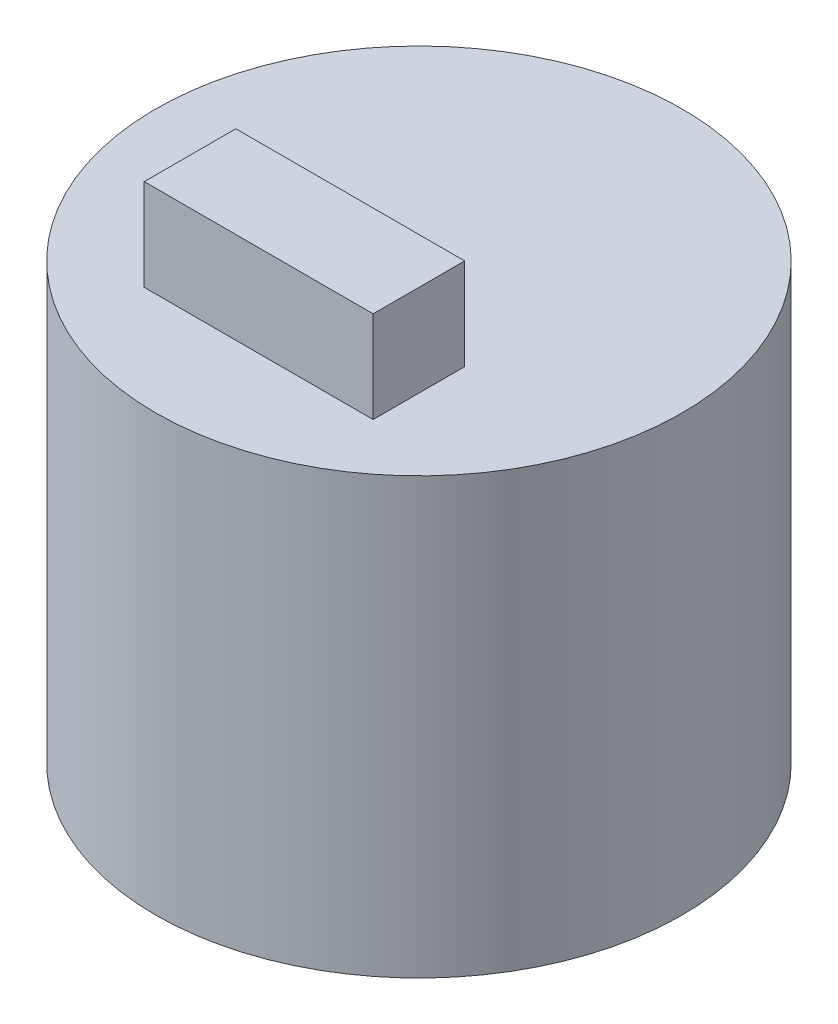
ISO-10303-21;
HEADER;
FILE_DESCRIPTION(('STEP AP214'),'2;1');
FILE_NAME('part.step','',(''),(''),'','','');
FILE_SCHEMA(('AUTOMOTIVE_DESIGN { 1 0 10303 214 1 1 1 1 }'));
ENDSEC;
DATA;
#1=APPLICATION_CONTEXT('core data for automotive mechanical design processes');
#2=APPLICATION_PROTOCOL_DEFINITION('international standard','automotive_design',2000,#1);
#3=PRODUCT_CONTEXT('',#1,'mechanical');
#4=PRODUCT('Part','Part','',(#3));
#5=PRODUCT_RELATED_PRODUCT_CATEGORY('part','',(#4));
#6=PRODUCT_DEFINITION_FORMATION('','',#4);
#7=PRODUCT_DEFINITION_CONTEXT('part definition',#1,'design');
#8=PRODUCT_DEFINITION('design','',#6,#7);
#9=PRODUCT_DEFINITION_SHAPE('','',#8);
#10=(LENGTH_UNIT() NAMED_UNIT(*) SI_UNIT(.MILLI.,.METRE.));
#11=(NAMED_UNIT(*) PLANE_ANGLE_UNIT() SI_UNIT($,.RADIAN.));
#12=(NAMED_UNIT(*) SI_UNIT($,.STERADIAN.) SOLID_ANGLE_UNIT());
#13=UNCERTAINTY_MEASURE_WITH_UNIT(LENGTH_MEASURE(1.E-05),#10,'distance_accuracy_value','');
#14=(GEOMETRIC_REPRESENTATION_CONTEXT(3) GLOBAL_UNCERTAINTY_ASSIGNED_CONTEXT((#13)) GLOBAL_UNIT_ASSIGNED_CONTEXT((#10,
#11,#12)) REPRESENTATION_CONTEXT('',''));
#15=CARTESIAN_POINT('',(0.,0.,0.));
#16=DIRECTION('',(0.,0.,1.));
#17=DIRECTION('',(1.,0.,0.));
#18=AXIS2_PLACEMENT_3D('',#15,#16,#17);
#19=CARTESIAN_POINT('',(0.,19.,0.));
#20=DIRECTION('',(0.,1.,0.));
#21=DIRECTION('',(0.,0.,1.));
#22=AXIS2_PLACEMENT_3D('',#19,#20,#21);
#23=PLANE('',#22);
#24=CARTESIAN_POINT('',(0.,19.,0.));
#25=DIRECTION('',(0.,1.,0.));
#26=DIRECTION('',(0.,0.,1.));
#27=AXIS2_PLACEMENT_3D('',#24,#25,#26);
#28=CIRCLE('',#27,11.5);
#29=CARTESIAN_POINT('',(0.,19.,11.5));
#30=VERTEX_POINT('',#29);
#31=EDGE_CURVE('E11',#30,#30,#28,.T.);
#32=ORIENTED_EDGE('',*,*,#31,.T.);
#33=EDGE_LOOP('',(#32));
#34=FACE_BOUND('',#33,.T.);
#35=DIRECTION('',(1.,0.,0.));
#36=VECTOR('',#35,1.);
#37=CARTESIAN_POINT('',(-5.,19.,7.));
#38=LINE('',#37,#36);
#39=CARTESIAN_POINT('',(-5.,19.,7.));
#40=VERTEX_POINT('',#39);
#41=CARTESIAN_POINT('',(5.,19.,7.));
#42=VERTEX_POINT('',#41);
#43=EDGE_CURVE('E92',#40,#42,#38,.T.);
#44=ORIENTED_EDGE('',*,*,#43,.F.);
#45=DIRECTION('',(0.,0.,1.));
#46=VECTOR('',#45,1.);
#47=CARTESIAN_POINT('',(-5.,19.,3.));
#48=LINE('',#47,#46);
#49=CARTESIAN_POINT('',(-5.,19.,3.));
#50=VERTEX_POINT('',#49);
#51=EDGE_CURVE('E103',#50,#40,#48,.T.);
#52=ORIENTED_EDGE('',*,*,#51,.F.);
#53=DIRECTION('',(-1.,0.,0.));
#54=VECTOR('',#53,1.);
#55=CARTESIAN_POINT('',(-5.,19.,3.));
#56=LINE('',#55,#54);
#57=CARTESIAN_POINT('',(5.,19.,3.));
#58=VERTEX_POINT('',#57);
#59=EDGE_CURVE('E73',#58,#50,#56,.T.);
#60=ORIENTED_EDGE('',*,*,#59,.F.);
#61=DIRECTION('',(0.,0.,-1.));
#62=VECTOR('',#61,1.);
#63=CARTESIAN_POINT('',(5.,19.,3.));
#64=LINE('',#63,#62);
#65=EDGE_CURVE('E108',#42,#58,#64,.T.);
#66=ORIENTED_EDGE('',*,*,#65,.F.);
#67=EDGE_LOOP('',(#44,#52,#60,#66));
#68=FACE_BOUND('',#67,.T.);
#69=ADVANCED_FACE('F36',(#34,#68),#23,.T.);
#70=CARTESIAN_POINT('',(0.,19.,0.));
#71=DIRECTION('',(0.,-1.,0.));
#72=DIRECTION('',(0.,0.,-1.));
#73=AXIS2_PLACEMENT_3D('',#70,#71,#72);
#74=CYLINDRICAL_SURFACE('',#73,11.5);
#75=ORIENTED_EDGE('',*,*,#31,.F.);
#76=EDGE_LOOP('',(#75));
#77=FACE_BOUND('',#76,.T.);
#78=CARTESIAN_POINT('',(0.,0.,0.));
#79=DIRECTION('',(0.,1.,0.));
#80=DIRECTION('',(0.,0.,1.));
#81=AXIS2_PLACEMENT_3D('',#78,#79,#80);
#82=CIRCLE('',#81,11.5);
#83=CARTESIAN_POINT('',(0.,0.,11.5));
#84=VERTEX_POINT('',#83);
#85=EDGE_CURVE('E40',#84,#84,#82,.T.);
#86=ORIENTED_EDGE('',*,*,#85,.T.);
#87=EDGE_LOOP('',(#86));
#88=FACE_BOUND('',#87,.T.);
#89=ADVANCED_FACE('F38',(#77,#88),#74,.T.);
#90=CARTESIAN_POINT('',(0.,0.,0.));
#91=DIRECTION('',(0.,1.,0.));
#92=DIRECTION('',(0.,0.,1.));
#93=AXIS2_PLACEMENT_3D('',#90,#91,#92);
#94=PLANE('',#93);
#95=CARTESIAN_POINT('',(0.,0.,-8.5));
#96=DIRECTION('',(0.,-1.,0.));
#97=DIRECTION('',(0.,0.,-1.));
#98=AXIS2_PLACEMENT_3D('',#95,#96,#97);
#99=CIRCLE('',#98,1.25);
#100=CARTESIAN_POINT('',(0.,0.,-9.75));
#101=VERTEX_POINT('',#100);
#102=EDGE_CURVE('E175',#101,#101,#99,.T.);
#103=ORIENTED_EDGE('',*,*,#102,.F.);
#104=EDGE_LOOP('',(#103));
#105=FACE_BOUND('',#104,.T.);
#106=CARTESIAN_POINT('',(0.,0.,8.5));
#107=DIRECTION('',(0.,-1.,0.));
#108=DIRECTION('',(0.,0.,-1.));
#109=AXIS2_PLACEMENT_3D('',#106,#107,#108);
#110=CIRCLE('',#109,1.25);
#111=CARTESIAN_POINT('',(0.,0.,7.25));
#112=VERTEX_POINT('',#111);
#113=EDGE_CURVE('E174',#112,#112,#110,.T.);
#114=ORIENTED_EDGE('',*,*,#113,.F.);
#115=EDGE_LOOP('',(#114));
#116=FACE_BOUND('',#115,.T.);
#117=CARTESIAN_POINT('',(0.,0.,0.));
#118=DIRECTION('',(0.,-1.,0.));
#119=DIRECTION('',(0.,0.,-1.));
#120=AXIS2_PLACEMENT_3D('',#117,#118,#119);
#121=CIRCLE('',#120,3.5);
#122=CARTESIAN_POINT('',(0.,0.,-3.5));
#123=VERTEX_POINT('',#122);
#124=EDGE_CURVE('E184',#123,#123,#121,.T.);
#125=ORIENTED_EDGE('',*,*,#124,.F.);
#126=EDGE_LOOP('',(#125));
#127=FACE_BOUND('',#126,.T.);
#128=ORIENTED_EDGE('',*,*,#85,.F.);
#129=EDGE_LOOP('',(#128));
#130=FACE_BOUND('',#129,.T.);
#131=ADVANCED_FACE('F117',(#105,#116,#127,#130),#94,.F.);
#132=CARTESIAN_POINT('',(-5.,23.,3.));
#133=DIRECTION('',(1.,0.,0.));
#134=DIRECTION('',(0.,0.,-1.));
#135=AXIS2_PLACEMENT_3D('',#132,#133,#134);
#136=PLANE('',#135);
#137=ORIENTED_EDGE('',*,*,#51,.T.);
#138=DIRECTION('',(0.,-1.,0.));
#139=VECTOR('',#138,1.);
#140=CARTESIAN_POINT('',(-5.,23.,7.));
#141=LINE('',#140,#139);
#142=CARTESIAN_POINT('',(-5.,23.,7.));
#143=VERTEX_POINT('',#142);
#144=EDGE_CURVE('E95',#143,#40,#141,.T.);
#145=ORIENTED_EDGE('',*,*,#144,.F.);
#146=DIRECTION('',(0.,0.,1.));
#147=VECTOR('',#146,1.);
#148=CARTESIAN_POINT('',(-5.,23.,3.));
#149=LINE('',#148,#147);
#150=CARTESIAN_POINT('',(-5.,23.,3.));
#151=VERTEX_POINT('',#150);
#152=EDGE_CURVE('E85',#151,#143,#149,.T.);
#153=ORIENTED_EDGE('',*,*,#152,.F.);
#154=DIRECTION('',(0.,-1.,0.));
#155=VECTOR('',#154,1.);
#156=CARTESIAN_POINT('',(-5.,23.,3.));
#157=LINE('',#156,#155);
#158=EDGE_CURVE('E99',#151,#50,#157,.T.);
#159=ORIENTED_EDGE('',*,*,#158,.T.);
#160=EDGE_LOOP('',(#137,#145,#153,#159));
#161=FACE_BOUND('',#160,.T.);
#162=ADVANCED_FACE('F119',(#161),#136,.F.);
#163=CARTESIAN_POINT('',(-5.,23.,7.));
#164=DIRECTION('',(0.,0.,-1.));
#165=DIRECTION('',(-1.,0.,0.));
#166=AXIS2_PLACEMENT_3D('',#163,#164,#165);
#167=PLANE('',#166);
#168=ORIENTED_EDGE('',*,*,#43,.T.);
#169=DIRECTION('',(0.,-1.,0.));
#170=VECTOR('',#169,1.);
#171=CARTESIAN_POINT('',(5.,23.,7.));
#172=LINE('',#171,#170);
#173=CARTESIAN_POINT('',(5.,23.,7.));
#174=VERTEX_POINT('',#173);
#175=EDGE_CURVE('E89',#174,#42,#172,.T.);
#176=ORIENTED_EDGE('',*,*,#175,.F.);
#177=DIRECTION('',(1.,0.,0.));
#178=VECTOR('',#177,1.);
#179=CARTESIAN_POINT('',(-5.,23.,7.));
#180=LINE('',#179,#178);
#181=EDGE_CURVE('E80',#143,#174,#180,.T.);
#182=ORIENTED_EDGE('',*,*,#181,.F.);
#183=ORIENTED_EDGE('',*,*,#144,.T.);
#184=EDGE_LOOP('',(#168,#176,#182,#183));
#185=FACE_BOUND('',#184,.T.);
#186=ADVANCED_FACE('F90',(#185),#167,.F.);
#187=CARTESIAN_POINT('',(5.,23.,3.));
#188=DIRECTION('',(-1.,0.,0.));
#189=DIRECTION('',(0.,0.,1.));
#190=AXIS2_PLACEMENT_3D('',#187,#188,#189);
#191=PLANE('',#190);
#192=ORIENTED_EDGE('',*,*,#65,.T.);
#193=DIRECTION('',(0.,-1.,0.));
#194=VECTOR('',#193,1.);
#195=CARTESIAN_POINT('',(5.,23.,3.));
#196=LINE('',#195,#194);
#197=CARTESIAN_POINT('',(5.,23.,3.));
#198=VERTEX_POINT('',#197);
#199=EDGE_CURVE('E51',#198,#58,#196,.T.);
#200=ORIENTED_EDGE('',*,*,#199,.F.);
#201=DIRECTION('',(0.,0.,-1.));
#202=VECTOR('',#201,1.);
#203=CARTESIAN_POINT('',(5.,23.,3.));
#204=LINE('',#203,#202);
#205=EDGE_CURVE('E83',#174,#198,#204,.T.);
#206=ORIENTED_EDGE('',*,*,#205,.F.);
#207=ORIENTED_EDGE('',*,*,#175,.T.);
#208=EDGE_LOOP('',(#192,#200,#206,#207));
#209=FACE_BOUND('',#208,.T.);
#210=ADVANCED_FACE('F97',(#209),#191,.F.);
#211=CARTESIAN_POINT('',(-5.,23.,3.));
#212=DIRECTION('',(0.,0.,1.));
#213=DIRECTION('',(1.,0.,0.));
#214=AXIS2_PLACEMENT_3D('',#211,#212,#213);
#215=PLANE('',#214);
#216=ORIENTED_EDGE('',*,*,#59,.T.);
#217=ORIENTED_EDGE('',*,*,#158,.F.);
#218=DIRECTION('',(-1.,0.,0.));
#219=VECTOR('',#218,1.);
#220=CARTESIAN_POINT('',(-5.,23.,3.));
#221=LINE('',#220,#219);
#222=EDGE_CURVE('E59',#198,#151,#221,.T.);
#223=ORIENTED_EDGE('',*,*,#222,.F.);
#224=ORIENTED_EDGE('',*,*,#199,.T.);
#225=EDGE_LOOP('',(#216,#217,#223,#224));
#226=FACE_BOUND('',#225,.T.);
#227=ADVANCED_FACE('F141',(#226),#215,.F.);
#228=CARTESIAN_POINT('',(0.,23.,0.));
#229=DIRECTION('',(0.,1.,0.));
#230=DIRECTION('',(0.,0.,1.));
#231=AXIS2_PLACEMENT_3D('',#228,#229,#230);
#232=PLANE('',#231);
#233=ORIENTED_EDGE('',*,*,#152,.T.);
#234=ORIENTED_EDGE('',*,*,#181,.T.);
#235=ORIENTED_EDGE('',*,*,#205,.T.);
#236=ORIENTED_EDGE('',*,*,#222,.T.);
#237=EDGE_LOOP('',(#233,#234,#235,#236));
#238=FACE_BOUND('',#237,.T.);
#239=ADVANCED_FACE('F81',(#238),#232,.T.);
#240=CARTESIAN_POINT('',(0.,9.,0.));
#241=DIRECTION('',(0.,-1.,0.));
#242=DIRECTION('',(0.,0.,-1.));
#243=AXIS2_PLACEMENT_3D('',#240,#241,#242);
#244=CYLINDRICAL_SURFACE('',#243,3.5);
#245=CARTESIAN_POINT('',(0.,9.,0.));
#246=DIRECTION('',(0.,-1.,0.));
#247=DIRECTION('',(0.,0.,-1.));
#248=AXIS2_PLACEMENT_3D('',#245,#246,#247);
#249=CIRCLE('',#248,3.5);
#250=CARTESIAN_POINT('',(0.,9.,-3.5));
#251=VERTEX_POINT('',#250);
#252=EDGE_CURVE('E106',#251,#251,#249,.T.);
#253=ORIENTED_EDGE('',*,*,#252,.F.);
#254=EDGE_LOOP('',(#253));
#255=FACE_BOUND('',#254,.T.);
#256=ORIENTED_EDGE('',*,*,#124,.T.);
#257=EDGE_LOOP('',(#256));
#258=FACE_BOUND('',#257,.T.);
#259=ADVANCED_FACE('F146',(#255,#258),#244,.F.);
#260=CARTESIAN_POINT('',(0.,9.,0.));
#261=DIRECTION('',(0.,-1.,0.));
#262=DIRECTION('',(0.,0.,-1.));
#263=AXIS2_PLACEMENT_3D('',#260,#261,#262);
#264=PLANE('',#263);
#265=ORIENTED_EDGE('',*,*,#252,.T.);
#266=EDGE_LOOP('',(#265));
#267=FACE_BOUND('',#266,.T.);
#268=ADVANCED_FACE('F149',(#267),#264,.T.);
#269=CARTESIAN_POINT('',(0.,9.,8.5));
#270=DIRECTION('',(0.,-1.,0.));
#271=DIRECTION('',(0.,0.,-1.));
#272=AXIS2_PLACEMENT_3D('',#269,#270,#271);
#273=CYLINDRICAL_SURFACE('',#272,1.25);
#274=CARTESIAN_POINT('',(0.,9.,8.5));
#275=DIRECTION('',(0.,-1.,0.));
#276=DIRECTION('',(0.,0.,-1.));
#277=AXIS2_PLACEMENT_3D('',#274,#275,#276);
#278=CIRCLE('',#277,1.25);
#279=CARTESIAN_POINT('',(0.,9.,7.25));
#280=VERTEX_POINT('',#279);
#281=EDGE_CURVE('E178',#280,#280,#278,.T.);
#282=ORIENTED_EDGE('',*,*,#281,.F.);
#283=EDGE_LOOP('',(#282));
#284=FACE_BOUND('',#283,.T.);
#285=ORIENTED_EDGE('',*,*,#113,.T.);
#286=EDGE_LOOP('',(#285));
#287=FACE_BOUND('',#286,.T.);
#288=ADVANCED_FACE('F153',(#284,#287),#273,.F.);
#289=CARTESIAN_POINT('',(0.,9.,8.5));
#290=DIRECTION('',(0.,-1.,0.));
#291=DIRECTION('',(0.,0.,-1.));
#292=AXIS2_PLACEMENT_3D('',#289,#290,#291);
#293=PLANE('',#292);
#294=ORIENTED_EDGE('',*,*,#281,.T.);
#295=EDGE_LOOP('',(#294));
#296=FACE_BOUND('',#295,.T.);
#297=ADVANCED_FACE('F157',(#296),#293,.T.);
#298=CARTESIAN_POINT('',(0.,9.,-8.5));
#299=DIRECTION('',(0.,-1.,0.));
#300=DIRECTION('',(0.,0.,-1.));
#301=AXIS2_PLACEMENT_3D('',#298,#299,#300);
#302=CYLINDRICAL_SURFACE('',#301,1.25);
#303=CARTESIAN_POINT('',(0.,9.,-8.5));
#304=DIRECTION('',(0.,-1.,0.));
#305=DIRECTION('',(0.,0.,-1.));
#306=AXIS2_PLACEMENT_3D('',#303,#304,#305);
#307=CIRCLE('',#306,1.25);
#308=CARTESIAN_POINT('',(0.,9.,-9.75));
#309=VERTEX_POINT('',#308);
#310=EDGE_CURVE('E173',#309,#309,#307,.T.);
#311=ORIENTED_EDGE('',*,*,#310,.F.);
#312=EDGE_LOOP('',(#311));
#313=FACE_BOUND('',#312,.T.);
#314=ORIENTED_EDGE('',*,*,#102,.T.);
#315=EDGE_LOOP('',(#314));
#316=FACE_BOUND('',#315,.T.);
#317=ADVANCED_FACE('F161',(#313,#316),#302,.F.);
#318=CARTESIAN_POINT('',(0.,9.,-8.5));
#319=DIRECTION('',(0.,-1.,0.));
#320=DIRECTION('',(0.,0.,-1.));
#321=AXIS2_PLACEMENT_3D('',#318,#319,#320);
#322=PLANE('',#321);
#323=ORIENTED_EDGE('',*,*,#310,.T.);
#324=EDGE_LOOP('',(#323));
#325=FACE_BOUND('',#324,.T.);
#326=ADVANCED_FACE('F165',(#325),#322,.T.);
#327=CLOSED_SHELL('',(#69,#89,#131,#162,#186,#210,#227,#239,#259,#268,#288,#297,#317,#326));
#328=MANIFOLD_SOLID_BREP('B2',#327);
#329=ADVANCED_BREP_SHAPE_REPRESENTATION('',(#18,#328),#14);
#330=SHAPE_DEFINITION_REPRESENTATION(#9,#329);
ENDSEC;
END-ISO-10303-21;
